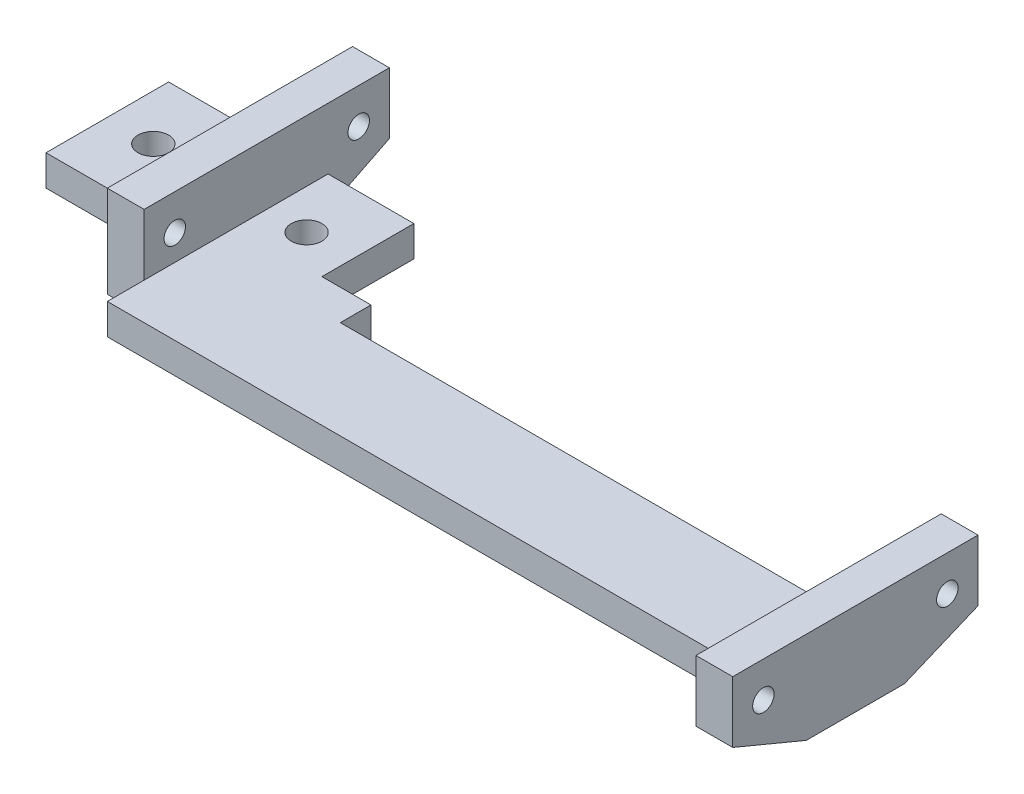
ISO-10303-21;
HEADER;
FILE_DESCRIPTION(('STEP AP214'),'2;1');
FILE_NAME('part.step','',(''),(''),'','','');
FILE_SCHEMA(('AUTOMOTIVE_DESIGN { 1 0 10303 214 1 1 1 1 }'));
ENDSEC;
DATA;
#1=APPLICATION_CONTEXT('core data for automotive mechanical design processes');
#2=APPLICATION_PROTOCOL_DEFINITION('international standard','automotive_design',2000,#1);
#3=PRODUCT_CONTEXT('',#1,'mechanical');
#4=PRODUCT('Part','Part','',(#3));
#5=PRODUCT_RELATED_PRODUCT_CATEGORY('part','',(#4));
#6=PRODUCT_DEFINITION_FORMATION('','',#4);
#7=PRODUCT_DEFINITION_CONTEXT('part definition',#1,'design');
#8=PRODUCT_DEFINITION('design','',#6,#7);
#9=PRODUCT_DEFINITION_SHAPE('','',#8);
#10=(LENGTH_UNIT() NAMED_UNIT(*) SI_UNIT(.MILLI.,.METRE.));
#11=(NAMED_UNIT(*) PLANE_ANGLE_UNIT() SI_UNIT($,.RADIAN.));
#12=(NAMED_UNIT(*) SI_UNIT($,.STERADIAN.) SOLID_ANGLE_UNIT());
#13=UNCERTAINTY_MEASURE_WITH_UNIT(LENGTH_MEASURE(1.E-05),#10,'distance_accuracy_value','');
#14=(GEOMETRIC_REPRESENTATION_CONTEXT(3) GLOBAL_UNCERTAINTY_ASSIGNED_CONTEXT((#13)) GLOBAL_UNIT_ASSIGNED_CONTEXT((#10,
#11,#12)) REPRESENTATION_CONTEXT('',''));
#15=CARTESIAN_POINT('',(0.,0.,0.));
#16=DIRECTION('',(0.,0.,1.));
#17=DIRECTION('',(1.,0.,0.));
#18=AXIS2_PLACEMENT_3D('',#15,#16,#17);
#19=CARTESIAN_POINT('',(100.,5.,0.));
#20=DIRECTION('',(0.,0.,1.));
#21=DIRECTION('',(1.,0.,0.));
#22=AXIS2_PLACEMENT_3D('',#19,#20,#21);
#23=PLANE('',#22);
#24=DIRECTION('',(0.,-1.,0.));
#25=VECTOR('',#24,1.);
#26=CARTESIAN_POINT('',(8.,5.,0.));
#27=LINE('',#26,#25);
#28=CARTESIAN_POINT('',(8.00000000000001,5.,0.));
#29=VERTEX_POINT('',#28);
#30=CARTESIAN_POINT('',(8.00000000000001,0.,0.));
#31=VERTEX_POINT('',#30);
#32=EDGE_CURVE('E54',#29,#31,#27,.T.);
#33=ORIENTED_EDGE('',*,*,#32,.F.);
#34=DIRECTION('',(-1.,0.,0.));
#35=VECTOR('',#34,1.);
#36=CARTESIAN_POINT('',(100.,5.,0.));
#37=LINE('',#36,#35);
#38=CARTESIAN_POINT('',(84.,5.,0.));
#39=VERTEX_POINT('',#38);
#40=EDGE_CURVE('E199',#39,#29,#37,.T.);
#41=ORIENTED_EDGE('',*,*,#40,.F.);
#42=DIRECTION('',(0.,-1.,0.));
#43=VECTOR('',#42,1.);
#44=CARTESIAN_POINT('',(84.,5.,0.));
#45=LINE('',#44,#43);
#46=CARTESIAN_POINT('',(84.,0.,0.));
#47=VERTEX_POINT('',#46);
#48=EDGE_CURVE('E236',#39,#47,#45,.T.);
#49=ORIENTED_EDGE('',*,*,#48,.T.);
#50=DIRECTION('',(-1.,0.,0.));
#51=VECTOR('',#50,1.);
#52=CARTESIAN_POINT('',(100.,0.,0.));
#53=LINE('',#52,#51);
#54=EDGE_CURVE('E370',#47,#31,#53,.T.);
#55=ORIENTED_EDGE('',*,*,#54,.T.);
#56=EDGE_LOOP('',(#33,#41,#49,#55));
#57=FACE_BOUND('',#56,.T.);
#58=ADVANCED_FACE('F40',(#57),#23,.F.);
#59=CARTESIAN_POINT('',(0.,5.,0.));
#60=DIRECTION('',(-1.,0.,0.));
#61=DIRECTION('',(0.,0.,1.));
#62=AXIS2_PLACEMENT_3D('',#59,#60,#61);
#63=PLANE('',#62);
#64=DIRECTION('',(0.,1.,0.));
#65=VECTOR('',#64,1.);
#66=CARTESIAN_POINT('',(0.,5.,-5.));
#67=LINE('',#66,#65);
#68=CARTESIAN_POINT('',(0.,0.,-5.));
#69=VERTEX_POINT('',#68);
#70=CARTESIAN_POINT('',(0.,5.,-5.));
#71=VERTEX_POINT('',#70);
#72=EDGE_CURVE('E191',#69,#71,#67,.T.);
#73=ORIENTED_EDGE('',*,*,#72,.F.);
#74=DIRECTION('',(0.,0.,-1.));
#75=VECTOR('',#74,1.);
#76=CARTESIAN_POINT('',(0.,0.,0.));
#77=LINE('',#76,#75);
#78=CARTESIAN_POINT('',(0.,0.,-20.));
#79=VERTEX_POINT('',#78);
#80=EDGE_CURVE('E384',#69,#79,#77,.T.);
#81=ORIENTED_EDGE('',*,*,#80,.T.);
#82=DIRECTION('',(0.,-1.,0.));
#83=VECTOR('',#82,1.);
#84=CARTESIAN_POINT('',(0.,5.,-20.));
#85=LINE('',#84,#83);
#86=CARTESIAN_POINT('',(0.,5.,-20.));
#87=VERTEX_POINT('',#86);
#88=EDGE_CURVE('E380',#87,#79,#85,.T.);
#89=ORIENTED_EDGE('',*,*,#88,.F.);
#90=DIRECTION('',(0.,0.,-1.));
#91=VECTOR('',#90,1.);
#92=CARTESIAN_POINT('',(0.,5.,0.));
#93=LINE('',#92,#91);
#94=EDGE_CURVE('E62',#71,#87,#93,.T.);
#95=ORIENTED_EDGE('',*,*,#94,.F.);
#96=EDGE_LOOP('',(#73,#81,#89,#95));
#97=FACE_BOUND('',#96,.T.);
#98=ADVANCED_FACE('F446',(#97),#63,.F.);
#99=CARTESIAN_POINT('',(0.,5.,0.));
#100=DIRECTION('',(0.,-1.,0.));
#101=DIRECTION('',(0.,0.,-1.));
#102=AXIS2_PLACEMENT_3D('',#99,#100,#101);
#103=PLANE('',#102);
#104=ORIENTED_EDGE('',*,*,#40,.T.);
#105=DIRECTION('',(0.,0.,1.));
#106=VECTOR('',#105,1.);
#107=CARTESIAN_POINT('',(8.,5.,-5.));
#108=LINE('',#107,#106);
#109=CARTESIAN_POINT('',(8.,5.,-5.));
#110=VERTEX_POINT('',#109);
#111=EDGE_CURVE('E195',#110,#29,#108,.T.);
#112=ORIENTED_EDGE('',*,*,#111,.F.);
#113=DIRECTION('',(1.,0.,0.));
#114=VECTOR('',#113,1.);
#115=CARTESIAN_POINT('',(0.,5.,-5.));
#116=LINE('',#115,#114);
#117=EDGE_CURVE('E184',#71,#110,#116,.T.);
#118=ORIENTED_EDGE('',*,*,#117,.F.);
#119=ORIENTED_EDGE('',*,*,#94,.T.);
#120=DIRECTION('',(-1.,0.,0.));
#121=VECTOR('',#120,1.);
#122=CARTESIAN_POINT('',(0.,5.,-20.));
#123=LINE('',#122,#121);
#124=CARTESIAN_POINT('',(-14.,5.,-20.));
#125=VERTEX_POINT('',#124);
#126=EDGE_CURVE('E375',#87,#125,#123,.T.);
#127=ORIENTED_EDGE('',*,*,#126,.T.);
#128=DIRECTION('',(0.,0.,-1.));
#129=VECTOR('',#128,1.);
#130=CARTESIAN_POINT('',(-14.,5.,-30.));
#131=LINE('',#130,#129);
#132=CARTESIAN_POINT('',(-14.,5.,10.));
#133=VERTEX_POINT('',#132);
#134=EDGE_CURVE('E262',#133,#125,#131,.T.);
#135=ORIENTED_EDGE('',*,*,#134,.F.);
#136=DIRECTION('',(0.,0.,-1.));
#137=VECTOR('',#136,1.);
#138=CARTESIAN_POINT('',(-14.,5.,10.));
#139=LINE('',#138,#137);
#140=CARTESIAN_POINT('',(-14.,5.,16.));
#141=VERTEX_POINT('',#140);
#142=EDGE_CURVE('E201',#141,#133,#139,.T.);
#143=ORIENTED_EDGE('',*,*,#142,.F.);
#144=DIRECTION('',(1.,0.,0.));
#145=VECTOR('',#144,1.);
#146=CARTESIAN_POINT('',(-20.,5.,16.));
#147=LINE('',#146,#145);
#148=CARTESIAN_POINT('',(84.,5.,16.));
#149=VERTEX_POINT('',#148);
#150=EDGE_CURVE('E378',#141,#149,#147,.T.);
#151=ORIENTED_EDGE('',*,*,#150,.T.);
#152=DIRECTION('',(0.64018439966448,0.,0.768221279597376));
#153=VECTOR('',#152,1.);
#154=CARTESIAN_POINT('',(94.,5.,28.));
#155=LINE('',#154,#153);
#156=CARTESIAN_POINT('',(94.,5.,28.));
#157=VERTEX_POINT('',#156);
#158=EDGE_CURVE('E227',#149,#157,#155,.T.);
#159=ORIENTED_EDGE('',*,*,#158,.T.);
#160=DIRECTION('',(0.,0.,-1.));
#161=VECTOR('',#160,1.);
#162=CARTESIAN_POINT('',(94.,5.,0.));
#163=LINE('',#162,#161);
#164=CARTESIAN_POINT('',(94.,5.,-12.));
#165=VERTEX_POINT('',#164);
#166=EDGE_CURVE('E360',#157,#165,#163,.T.);
#167=ORIENTED_EDGE('',*,*,#166,.T.);
#168=DIRECTION('',(-0.640184399664479,0.,0.768221279597377));
#169=VECTOR('',#168,1.);
#170=CARTESIAN_POINT('',(84.,5.,0.));
#171=LINE('',#170,#169);
#172=EDGE_CURVE('E222',#165,#39,#171,.T.);
#173=ORIENTED_EDGE('',*,*,#172,.T.);
#174=EDGE_LOOP('',(#104,#112,#118,#119,#127,#135,#143,#151,#159,#167,#173));
#175=FACE_BOUND('',#174,.T.);
#176=CARTESIAN_POINT('',(-7.5,5.,-10.));
#177=DIRECTION('',(0.,1.,0.));
#178=DIRECTION('',(0.,0.,1.));
#179=AXIS2_PLACEMENT_3D('',#176,#177,#178);
#180=CIRCLE('',#179,2.5);
#181=CARTESIAN_POINT('',(-7.5,5.,-7.5));
#182=VERTEX_POINT('',#181);
#183=EDGE_CURVE('E288',#182,#182,#180,.T.);
#184=ORIENTED_EDGE('',*,*,#183,.F.);
#185=EDGE_LOOP('',(#184));
#186=FACE_BOUND('',#185,.T.);
#187=ADVANCED_FACE('F196',(#175,#186),#103,.F.);
#188=CARTESIAN_POINT('',(94.,0.,16.));
#189=DIRECTION('',(0.,-0.923076923076923,0.384615384615385));
#190=DIRECTION('',(0.,-0.384615384615385,-0.923076923076923));
#191=AXIS2_PLACEMENT_3D('',#188,#189,#190);
#192=PLANE('',#191);
#193=DIRECTION('',(1.,0.,0.));
#194=VECTOR('',#193,1.);
#195=CARTESIAN_POINT('',(94.,5.,28.));
#196=LINE('',#195,#194);
#197=CARTESIAN_POINT('',(100.,5.,28.));
#198=VERTEX_POINT('',#197);
#199=EDGE_CURVE('E361',#157,#198,#196,.T.);
#200=ORIENTED_EDGE('',*,*,#199,.F.);
#201=DIRECTION('',(-0.609710760849692,-0.304855380424846,-0.731652913019631));
#202=VECTOR('',#201,1.);
#203=CARTESIAN_POINT('',(84.,0.,16.));
#204=LINE('',#203,#202);
#205=CARTESIAN_POINT('',(84.,0.,16.));
#206=VERTEX_POINT('',#205);
#207=EDGE_CURVE('E230',#157,#206,#204,.T.);
#208=ORIENTED_EDGE('',*,*,#207,.T.);
#209=DIRECTION('',(1.,0.,0.));
#210=VECTOR('',#209,1.);
#211=CARTESIAN_POINT('',(94.,0.,16.));
#212=LINE('',#211,#210);
#213=CARTESIAN_POINT('',(100.,0.,16.));
#214=VERTEX_POINT('',#213);
#215=EDGE_CURVE('E357',#206,#214,#212,.T.);
#216=ORIENTED_EDGE('',*,*,#215,.T.);
#217=DIRECTION('',(0.,-0.384615384615385,-0.923076923076923));
#218=VECTOR('',#217,1.);
#219=CARTESIAN_POINT('',(100.,0.,16.));
#220=LINE('',#219,#218);
#221=EDGE_CURVE('E337',#198,#214,#220,.T.);
#222=ORIENTED_EDGE('',*,*,#221,.F.);
#223=EDGE_LOOP('',(#200,#208,#216,#222));
#224=FACE_BOUND('',#223,.T.);
#225=ADVANCED_FACE('F492',(#224),#192,.T.);
#226=CARTESIAN_POINT('',(94.,0.,0.));
#227=DIRECTION('',(-1.,0.,0.));
#228=DIRECTION('',(0.,0.,1.));
#229=AXIS2_PLACEMENT_3D('',#226,#227,#228);
#230=PLANE('',#229);
#231=CARTESIAN_POINT('',(94.,9.2,23.));
#232=DIRECTION('',(1.,0.,0.));
#233=DIRECTION('',(0.,0.,-1.));
#234=AXIS2_PLACEMENT_3D('',#231,#232,#233);
#235=CIRCLE('',#234,1.75);
#236=CARTESIAN_POINT('',(94.,9.2,21.25));
#237=VERTEX_POINT('',#236);
#238=EDGE_CURVE('E327',#237,#237,#235,.T.);
#239=ORIENTED_EDGE('',*,*,#238,.T.);
#240=EDGE_LOOP('',(#239));
#241=FACE_BOUND('',#240,.T.);
#242=CARTESIAN_POINT('',(94.,9.2,-7.));
#243=DIRECTION('',(1.,0.,0.));
#244=DIRECTION('',(0.,0.,-1.));
#245=AXIS2_PLACEMENT_3D('',#242,#243,#244);
#246=CIRCLE('',#245,1.75);
#247=CARTESIAN_POINT('',(94.,9.2,-8.75));
#248=VERTEX_POINT('',#247);
#249=EDGE_CURVE('E321',#248,#248,#246,.T.);
#250=ORIENTED_EDGE('',*,*,#249,.T.);
#251=EDGE_LOOP('',(#250));
#252=FACE_BOUND('',#251,.T.);
#253=DIRECTION('',(0.,1.,0.));
#254=VECTOR('',#253,1.);
#255=CARTESIAN_POINT('',(94.,15.,-12.));
#256=LINE('',#255,#254);
#257=CARTESIAN_POINT('',(94.,15.,-12.));
#258=VERTEX_POINT('',#257);
#259=EDGE_CURVE('E333',#165,#258,#256,.T.);
#260=ORIENTED_EDGE('',*,*,#259,.F.);
#261=ORIENTED_EDGE('',*,*,#166,.F.);
#262=DIRECTION('',(0.,-1.,0.));
#263=VECTOR('',#262,1.);
#264=CARTESIAN_POINT('',(94.,5.,28.));
#265=LINE('',#264,#263);
#266=CARTESIAN_POINT('',(94.,15.,28.));
#267=VERTEX_POINT('',#266);
#268=EDGE_CURVE('E340',#267,#157,#265,.T.);
#269=ORIENTED_EDGE('',*,*,#268,.F.);
#270=DIRECTION('',(0.,0.,1.));
#271=VECTOR('',#270,1.);
#272=CARTESIAN_POINT('',(94.,15.,28.));
#273=LINE('',#272,#271);
#274=EDGE_CURVE('E336',#258,#267,#273,.T.);
#275=ORIENTED_EDGE('',*,*,#274,.F.);
#276=EDGE_LOOP('',(#260,#261,#269,#275));
#277=FACE_BOUND('',#276,.T.);
#278=ADVANCED_FACE('F464',(#241,#252,#277),#230,.T.);
#279=CARTESIAN_POINT('',(0.,5.,-20.));
#280=DIRECTION('',(0.,0.,1.));
#281=DIRECTION('',(1.,0.,0.));
#282=AXIS2_PLACEMENT_3D('',#279,#280,#281);
#283=PLANE('',#282);
#284=DIRECTION('',(0.,1.,0.));
#285=VECTOR('',#284,1.);
#286=CARTESIAN_POINT('',(-20.,0.,-20.));
#287=LINE('',#286,#285);
#288=CARTESIAN_POINT('',(-20.,0.,-20.));
#289=VERTEX_POINT('',#288);
#290=CARTESIAN_POINT('',(-20.,5.,-20.));
#291=VERTEX_POINT('',#290);
#292=EDGE_CURVE('E258',#289,#291,#287,.T.);
#293=ORIENTED_EDGE('',*,*,#292,.F.);
#294=DIRECTION('',(-1.,0.,0.));
#295=VECTOR('',#294,1.);
#296=CARTESIAN_POINT('',(0.,0.,-20.));
#297=LINE('',#296,#295);
#298=CARTESIAN_POINT('',(-40.,0.,-20.));
#299=VERTEX_POINT('',#298);
#300=EDGE_CURVE('E386',#289,#299,#297,.T.);
#301=ORIENTED_EDGE('',*,*,#300,.T.);
#302=DIRECTION('',(0.,-1.,0.));
#303=VECTOR('',#302,1.);
#304=CARTESIAN_POINT('',(-40.,5.,-20.));
#305=LINE('',#304,#303);
#306=CARTESIAN_POINT('',(-40.,5.,-20.));
#307=VERTEX_POINT('',#306);
#308=EDGE_CURVE('E312',#307,#299,#305,.T.);
#309=ORIENTED_EDGE('',*,*,#308,.F.);
#310=EDGE_CURVE('E374',#291,#307,#123,.T.);
#311=ORIENTED_EDGE('',*,*,#310,.F.);
#312=EDGE_LOOP('',(#293,#301,#309,#311));
#313=FACE_BOUND('',#312,.T.);
#314=ADVANCED_FACE('F409',(#313),#283,.F.);
#315=DIRECTION('',(0.,-1.,0.));
#316=VECTOR('',#315,1.);
#317=CARTESIAN_POINT('',(-14.,0.,-20.));
#318=LINE('',#317,#316);
#319=CARTESIAN_POINT('',(-14.,0.,-20.));
#320=VERTEX_POINT('',#319);
#321=EDGE_CURVE('E252',#125,#320,#318,.T.);
#322=ORIENTED_EDGE('',*,*,#321,.F.);
#323=ORIENTED_EDGE('',*,*,#126,.F.);
#324=ORIENTED_EDGE('',*,*,#88,.T.);
#325=EDGE_CURVE('E387',#79,#320,#297,.T.);
#326=ORIENTED_EDGE('',*,*,#325,.T.);
#327=EDGE_LOOP('',(#322,#323,#324,#326));
#328=FACE_BOUND('',#327,.T.);
#329=ADVANCED_FACE('F444',(#328),#283,.F.);
#330=CARTESIAN_POINT('',(-32.5,5.,-10.));
#331=DIRECTION('',(0.,1.,0.));
#332=DIRECTION('',(0.,0.,1.));
#333=AXIS2_PLACEMENT_3D('',#330,#331,#332);
#334=CIRCLE('',#333,2.5);
#335=CARTESIAN_POINT('',(-32.5,5.,-7.5));
#336=VERTEX_POINT('',#335);
#337=EDGE_CURVE('E293',#336,#336,#334,.T.);
#338=ORIENTED_EDGE('',*,*,#337,.F.);
#339=EDGE_LOOP('',(#338));
#340=FACE_BOUND('',#339,.T.);
#341=DIRECTION('',(0.,0.,1.));
#342=VECTOR('',#341,1.);
#343=CARTESIAN_POINT('',(-20.,5.,0.));
#344=LINE('',#343,#342);
#345=CARTESIAN_POINT('',(-20.,5.,0.));
#346=VERTEX_POINT('',#345);
#347=EDGE_CURVE('E47',#291,#346,#344,.T.);
#348=ORIENTED_EDGE('',*,*,#347,.F.);
#349=ORIENTED_EDGE('',*,*,#310,.T.);
#350=DIRECTION('',(0.,0.,-1.));
#351=VECTOR('',#350,1.);
#352=CARTESIAN_POINT('',(-40.,5.,-20.));
#353=LINE('',#352,#351);
#354=CARTESIAN_POINT('',(-40.,5.,0.));
#355=VERTEX_POINT('',#354);
#356=EDGE_CURVE('E315',#355,#307,#353,.T.);
#357=ORIENTED_EDGE('',*,*,#356,.F.);
#358=DIRECTION('',(1.,0.,0.));
#359=VECTOR('',#358,1.);
#360=CARTESIAN_POINT('',(-100.615528128088,5.,0.));
#361=LINE('',#360,#359);
#362=EDGE_CURVE('E304',#355,#346,#361,.T.);
#363=ORIENTED_EDGE('',*,*,#362,.T.);
#364=EDGE_LOOP('',(#348,#349,#357,#363));
#365=FACE_BOUND('',#364,.T.);
#366=ADVANCED_FACE('F405',(#340,#365),#103,.F.);
#367=CARTESIAN_POINT('',(-20.,5.,-20.));
#368=DIRECTION('',(1.,0.,0.));
#369=DIRECTION('',(0.,0.,-1.));
#370=AXIS2_PLACEMENT_3D('',#367,#368,#369);
#371=PLANE('',#370);
#372=CARTESIAN_POINT('',(-20.,9.2,-25.));
#373=DIRECTION('',(-1.,0.,0.));
#374=DIRECTION('',(0.,0.,1.));
#375=AXIS2_PLACEMENT_3D('',#372,#373,#374);
#376=CIRCLE('',#375,1.75);
#377=CARTESIAN_POINT('',(-20.,9.2,-23.25));
#378=VERTEX_POINT('',#377);
#379=EDGE_CURVE('E240',#378,#378,#376,.T.);
#380=ORIENTED_EDGE('',*,*,#379,.F.);
#381=EDGE_LOOP('',(#380));
#382=FACE_BOUND('',#381,.T.);
#383=CARTESIAN_POINT('',(-20.,9.2,5.));
#384=DIRECTION('',(-1.,0.,0.));
#385=DIRECTION('',(0.,0.,1.));
#386=AXIS2_PLACEMENT_3D('',#383,#384,#385);
#387=CIRCLE('',#386,1.75);
#388=CARTESIAN_POINT('',(-20.,9.2,6.75));
#389=VERTEX_POINT('',#388);
#390=EDGE_CURVE('E239',#389,#389,#387,.T.);
#391=ORIENTED_EDGE('',*,*,#390,.F.);
#392=EDGE_LOOP('',(#391));
#393=FACE_BOUND('',#392,.T.);
#394=DIRECTION('',(0.,0.,1.));
#395=VECTOR('',#394,1.);
#396=CARTESIAN_POINT('',(-20.,0.,-20.));
#397=LINE('',#396,#395);
#398=CARTESIAN_POINT('',(-20.,0.,0.));
#399=VERTEX_POINT('',#398);
#400=CARTESIAN_POINT('',(-20.,0.,10.));
#401=VERTEX_POINT('',#400);
#402=EDGE_CURVE('E390',#399,#401,#397,.T.);
#403=ORIENTED_EDGE('',*,*,#402,.T.);
#404=DIRECTION('',(0.,-1.,0.));
#405=VECTOR('',#404,1.);
#406=CARTESIAN_POINT('',(-20.,15.,9.99999999999999));
#407=LINE('',#406,#405);
#408=CARTESIAN_POINT('',(-20.,15.,9.99999999999999));
#409=VERTEX_POINT('',#408);
#410=EDGE_CURVE('E286',#409,#401,#407,.T.);
#411=ORIENTED_EDGE('',*,*,#410,.F.);
#412=DIRECTION('',(0.,0.,1.));
#413=VECTOR('',#412,1.);
#414=CARTESIAN_POINT('',(-20.,15.,-30.));
#415=LINE('',#414,#413);
#416=CARTESIAN_POINT('',(-20.,15.,-30.));
#417=VERTEX_POINT('',#416);
#418=EDGE_CURVE('E263',#417,#409,#415,.T.);
#419=ORIENTED_EDGE('',*,*,#418,.F.);
#420=DIRECTION('',(0.,-1.,0.));
#421=VECTOR('',#420,1.);
#422=CARTESIAN_POINT('',(-20.,15.,-30.));
#423=LINE('',#422,#421);
#424=CARTESIAN_POINT('',(-20.,5.,-30.));
#425=VERTEX_POINT('',#424);
#426=EDGE_CURVE('E273',#417,#425,#423,.T.);
#427=ORIENTED_EDGE('',*,*,#426,.T.);
#428=DIRECTION('',(0.,-0.447213595499958,0.894427190999916));
#429=VECTOR('',#428,1.);
#430=CARTESIAN_POINT('',(-20.,5.,-30.));
#431=LINE('',#430,#429);
#432=EDGE_CURVE('E247',#425,#289,#431,.T.);
#433=ORIENTED_EDGE('',*,*,#432,.T.);
#434=ORIENTED_EDGE('',*,*,#292,.T.);
#435=ORIENTED_EDGE('',*,*,#347,.T.);
#436=DIRECTION('',(0.,1.,0.));
#437=VECTOR('',#436,1.);
#438=CARTESIAN_POINT('',(-20.,5.,0.));
#439=LINE('',#438,#437);
#440=EDGE_CURVE('E301',#399,#346,#439,.T.);
#441=ORIENTED_EDGE('',*,*,#440,.F.);
#442=EDGE_LOOP('',(#403,#411,#419,#427,#433,#434,#435,#441));
#443=FACE_BOUND('',#442,.T.);
#444=ADVANCED_FACE('F400',(#382,#393,#443),#371,.F.);
#445=CARTESIAN_POINT('',(-20.,5.,16.));
#446=DIRECTION('',(0.,0.,-1.));
#447=DIRECTION('',(-1.,0.,0.));
#448=AXIS2_PLACEMENT_3D('',#445,#446,#447);
#449=PLANE('',#448);
#450=ORIENTED_EDGE('',*,*,#150,.F.);
#451=DIRECTION('',(0.,1.,0.));
#452=VECTOR('',#451,1.);
#453=CARTESIAN_POINT('',(-14.,-5.,16.));
#454=LINE('',#453,#452);
#455=CARTESIAN_POINT('',(-14.,0.,16.));
#456=VERTEX_POINT('',#455);
#457=EDGE_CURVE('E215',#456,#141,#454,.T.);
#458=ORIENTED_EDGE('',*,*,#457,.F.);
#459=DIRECTION('',(1.,0.,0.));
#460=VECTOR('',#459,1.);
#461=CARTESIAN_POINT('',(-20.,0.,16.));
#462=LINE('',#461,#460);
#463=EDGE_CURVE('E393',#456,#206,#462,.T.);
#464=ORIENTED_EDGE('',*,*,#463,.T.);
#465=DIRECTION('',(0.,1.,0.));
#466=VECTOR('',#465,1.);
#467=CARTESIAN_POINT('',(84.,5.,16.));
#468=LINE('',#467,#466);
#469=EDGE_CURVE('E233',#206,#149,#468,.T.);
#470=ORIENTED_EDGE('',*,*,#469,.T.);
#471=EDGE_LOOP('',(#450,#458,#464,#470));
#472=FACE_BOUND('',#471,.T.);
#473=ADVANCED_FACE('F498',(#472),#449,.F.);
#474=CARTESIAN_POINT('',(100.,5.,16.));
#475=DIRECTION('',(-1.,0.,0.));
#476=DIRECTION('',(0.,0.,1.));
#477=AXIS2_PLACEMENT_3D('',#474,#475,#476);
#478=PLANE('',#477);
#479=DIRECTION('',(0.,0.,-1.));
#480=VECTOR('',#479,1.);
#481=CARTESIAN_POINT('',(100.,0.,16.));
#482=LINE('',#481,#480);
#483=CARTESIAN_POINT('',(100.,0.,0.));
#484=VERTEX_POINT('',#483);
#485=EDGE_CURVE('E372',#214,#484,#482,.T.);
#486=ORIENTED_EDGE('',*,*,#485,.T.);
#487=DIRECTION('',(0.,0.384615384615385,-0.923076923076923));
#488=VECTOR('',#487,1.);
#489=CARTESIAN_POINT('',(100.,5.,-12.));
#490=LINE('',#489,#488);
#491=CARTESIAN_POINT('',(100.,5.,-12.));
#492=VERTEX_POINT('',#491);
#493=EDGE_CURVE('E330',#484,#492,#490,.T.);
#494=ORIENTED_EDGE('',*,*,#493,.T.);
#495=DIRECTION('',(0.,1.,0.));
#496=VECTOR('',#495,1.);
#497=CARTESIAN_POINT('',(100.,15.,-12.));
#498=LINE('',#497,#496);
#499=CARTESIAN_POINT('',(100.,15.,-12.));
#500=VERTEX_POINT('',#499);
#501=EDGE_CURVE('E346',#492,#500,#498,.T.);
#502=ORIENTED_EDGE('',*,*,#501,.T.);
#503=DIRECTION('',(0.,0.,1.));
#504=VECTOR('',#503,1.);
#505=CARTESIAN_POINT('',(100.,15.,28.));
#506=LINE('',#505,#504);
#507=CARTESIAN_POINT('',(100.,15.,28.));
#508=VERTEX_POINT('',#507);
#509=EDGE_CURVE('E349',#500,#508,#506,.T.);
#510=ORIENTED_EDGE('',*,*,#509,.T.);
#511=DIRECTION('',(0.,-1.,0.));
#512=VECTOR('',#511,1.);
#513=CARTESIAN_POINT('',(100.,5.,28.));
#514=LINE('',#513,#512);
#515=EDGE_CURVE('E352',#508,#198,#514,.T.);
#516=ORIENTED_EDGE('',*,*,#515,.T.);
#517=ORIENTED_EDGE('',*,*,#221,.T.);
#518=EDGE_LOOP('',(#486,#494,#502,#510,#516,#517));
#519=FACE_BOUND('',#518,.T.);
#520=CARTESIAN_POINT('',(100.,9.2,-7.));
#521=DIRECTION('',(1.,0.,0.));
#522=DIRECTION('',(0.,0.,-1.));
#523=AXIS2_PLACEMENT_3D('',#520,#521,#522);
#524=CIRCLE('',#523,1.75);
#525=CARTESIAN_POINT('',(100.,9.2,-8.75));
#526=VERTEX_POINT('',#525);
#527=EDGE_CURVE('E308',#526,#526,#524,.T.);
#528=ORIENTED_EDGE('',*,*,#527,.F.);
#529=EDGE_LOOP('',(#528));
#530=FACE_BOUND('',#529,.T.);
#531=CARTESIAN_POINT('',(100.,9.2,23.));
#532=DIRECTION('',(1.,0.,0.));
#533=DIRECTION('',(0.,0.,-1.));
#534=AXIS2_PLACEMENT_3D('',#531,#532,#533);
#535=CIRCLE('',#534,1.75);
#536=CARTESIAN_POINT('',(100.,9.2,21.25));
#537=VERTEX_POINT('',#536);
#538=EDGE_CURVE('E324',#537,#537,#535,.T.);
#539=ORIENTED_EDGE('',*,*,#538,.F.);
#540=EDGE_LOOP('',(#539));
#541=FACE_BOUND('',#540,.T.);
#542=ADVANCED_FACE('F470',(#519,#530,#541),#478,.F.);
#543=CARTESIAN_POINT('',(0.,0.,0.));
#544=DIRECTION('',(0.,-1.,0.));
#545=DIRECTION('',(0.,0.,-1.));
#546=AXIS2_PLACEMENT_3D('',#543,#544,#545);
#547=PLANE('',#546);
#548=ORIENTED_EDGE('',*,*,#80,.F.);
#549=DIRECTION('',(-1.,0.,0.));
#550=VECTOR('',#549,1.);
#551=CARTESIAN_POINT('',(0.,0.,-5.));
#552=LINE('',#551,#550);
#553=CARTESIAN_POINT('',(8.,0.,-5.));
#554=VERTEX_POINT('',#553);
#555=EDGE_CURVE('E207',#554,#69,#552,.T.);
#556=ORIENTED_EDGE('',*,*,#555,.F.);
#557=DIRECTION('',(0.,0.,1.));
#558=VECTOR('',#557,1.);
#559=CARTESIAN_POINT('',(8.,0.,-5.));
#560=LINE('',#559,#558);
#561=EDGE_CURVE('E202',#554,#31,#560,.T.);
#562=ORIENTED_EDGE('',*,*,#561,.T.);
#563=ORIENTED_EDGE('',*,*,#54,.F.);
#564=EDGE_CURVE('E381',#484,#47,#53,.T.);
#565=ORIENTED_EDGE('',*,*,#564,.F.);
#566=ORIENTED_EDGE('',*,*,#485,.F.);
#567=ORIENTED_EDGE('',*,*,#215,.F.);
#568=ORIENTED_EDGE('',*,*,#463,.F.);
#569=DIRECTION('',(0.,0.,1.));
#570=VECTOR('',#569,1.);
#571=CARTESIAN_POINT('',(-14.,0.,0.));
#572=LINE('',#571,#570);
#573=CARTESIAN_POINT('',(-14.,0.,10.));
#574=VERTEX_POINT('',#573);
#575=EDGE_CURVE('E12',#574,#456,#572,.T.);
#576=ORIENTED_EDGE('',*,*,#575,.F.);
#577=DIRECTION('',(1.,0.,0.));
#578=VECTOR('',#577,1.);
#579=CARTESIAN_POINT('',(0.,0.,10.));
#580=LINE('',#579,#578);
#581=EDGE_CURVE('E219',#401,#574,#580,.T.);
#582=ORIENTED_EDGE('',*,*,#581,.F.);
#583=ORIENTED_EDGE('',*,*,#402,.F.);
#584=DIRECTION('',(1.,0.,0.));
#585=VECTOR('',#584,1.);
#586=CARTESIAN_POINT('',(-100.615528128088,0.,0.));
#587=LINE('',#586,#585);
#588=CARTESIAN_POINT('',(-40.,0.,0.));
#589=VERTEX_POINT('',#588);
#590=EDGE_CURVE('E292',#589,#399,#587,.T.);
#591=ORIENTED_EDGE('',*,*,#590,.F.);
#592=DIRECTION('',(0.,0.,1.));
#593=VECTOR('',#592,1.);
#594=CARTESIAN_POINT('',(-40.,0.,-20.));
#595=LINE('',#594,#593);
#596=EDGE_CURVE('E309',#299,#589,#595,.T.);
#597=ORIENTED_EDGE('',*,*,#596,.F.);
#598=ORIENTED_EDGE('',*,*,#300,.F.);
#599=DIRECTION('',(-1.,0.,0.));
#600=VECTOR('',#599,1.);
#601=CARTESIAN_POINT('',(-2.81966011250105,0.,-20.));
#602=LINE('',#601,#600);
#603=EDGE_CURVE('E255',#320,#289,#602,.T.);
#604=ORIENTED_EDGE('',*,*,#603,.F.);
#605=ORIENTED_EDGE('',*,*,#325,.F.);
#606=EDGE_LOOP('',(#548,#556,#562,#563,#565,#566,#567,#568,#576,#582,#583,#591,#597,#598,#604,#605));
#607=FACE_BOUND('',#606,.T.);
#608=CARTESIAN_POINT('',(-32.5,0.,-10.));
#609=DIRECTION('',(0.,1.,0.));
#610=DIRECTION('',(0.,0.,1.));
#611=AXIS2_PLACEMENT_3D('',#608,#609,#610);
#612=CIRCLE('',#611,2.5);
#613=CARTESIAN_POINT('',(-32.5,0.,-7.5));
#614=VERTEX_POINT('',#613);
#615=EDGE_CURVE('E289',#614,#614,#612,.T.);
#616=ORIENTED_EDGE('',*,*,#615,.T.);
#617=EDGE_LOOP('',(#616));
#618=FACE_BOUND('',#617,.T.);
#619=CARTESIAN_POINT('',(-7.5,0.,-10.));
#620=DIRECTION('',(0.,1.,0.));
#621=DIRECTION('',(0.,0.,1.));
#622=AXIS2_PLACEMENT_3D('',#619,#620,#621);
#623=CIRCLE('',#622,2.5);
#624=CARTESIAN_POINT('',(-7.5,0.,-7.5));
#625=VERTEX_POINT('',#624);
#626=EDGE_CURVE('E296',#625,#625,#623,.T.);
#627=ORIENTED_EDGE('',*,*,#626,.T.);
#628=EDGE_LOOP('',(#627));
#629=FACE_BOUND('',#628,.T.);
#630=ADVANCED_FACE('F419',(#607,#618,#629),#547,.T.);
#631=CARTESIAN_POINT('',(94.,5.,28.));
#632=DIRECTION('',(0.,0.,1.));
#633=DIRECTION('',(1.,0.,0.));
#634=AXIS2_PLACEMENT_3D('',#631,#632,#633);
#635=PLANE('',#634);
#636=ORIENTED_EDGE('',*,*,#515,.F.);
#637=DIRECTION('',(1.,0.,0.));
#638=VECTOR('',#637,1.);
#639=CARTESIAN_POINT('',(94.,15.,28.));
#640=LINE('',#639,#638);
#641=EDGE_CURVE('E363',#267,#508,#640,.T.);
#642=ORIENTED_EDGE('',*,*,#641,.F.);
#643=ORIENTED_EDGE('',*,*,#268,.T.);
#644=ORIENTED_EDGE('',*,*,#199,.T.);
#645=EDGE_LOOP('',(#636,#642,#643,#644));
#646=FACE_BOUND('',#645,.T.);
#647=ADVANCED_FACE('F506',(#646),#635,.T.);
#648=CARTESIAN_POINT('',(94.,15.,28.));
#649=DIRECTION('',(0.,1.,0.));
#650=DIRECTION('',(0.,0.,1.));
#651=AXIS2_PLACEMENT_3D('',#648,#649,#650);
#652=PLANE('',#651);
#653=ORIENTED_EDGE('',*,*,#509,.F.);
#654=DIRECTION('',(1.,0.,0.));
#655=VECTOR('',#654,1.);
#656=CARTESIAN_POINT('',(94.,15.,-12.));
#657=LINE('',#656,#655);
#658=EDGE_CURVE('E365',#258,#500,#657,.T.);
#659=ORIENTED_EDGE('',*,*,#658,.F.);
#660=ORIENTED_EDGE('',*,*,#274,.T.);
#661=ORIENTED_EDGE('',*,*,#641,.T.);
#662=EDGE_LOOP('',(#653,#659,#660,#661));
#663=FACE_BOUND('',#662,.T.);
#664=ADVANCED_FACE('F467',(#663),#652,.T.);
#665=CARTESIAN_POINT('',(94.,15.,-12.));
#666=DIRECTION('',(0.,0.,-1.));
#667=DIRECTION('',(0.,1.,0.));
#668=AXIS2_PLACEMENT_3D('',#665,#666,#667);
#669=PLANE('',#668);
#670=ORIENTED_EDGE('',*,*,#501,.F.);
#671=DIRECTION('',(1.,0.,0.));
#672=VECTOR('',#671,1.);
#673=CARTESIAN_POINT('',(94.,5.,-12.));
#674=LINE('',#673,#672);
#675=EDGE_CURVE('E343',#165,#492,#674,.T.);
#676=ORIENTED_EDGE('',*,*,#675,.F.);
#677=ORIENTED_EDGE('',*,*,#259,.T.);
#678=ORIENTED_EDGE('',*,*,#658,.T.);
#679=EDGE_LOOP('',(#670,#676,#677,#678));
#680=FACE_BOUND('',#679,.T.);
#681=ADVANCED_FACE('F461',(#680),#669,.T.);
#682=CARTESIAN_POINT('',(94.,5.,-12.));
#683=DIRECTION('',(0.,-0.923076923076923,-0.384615384615385));
#684=DIRECTION('',(0.,0.384615384615385,-0.923076923076923));
#685=AXIS2_PLACEMENT_3D('',#682,#683,#684);
#686=PLANE('',#685);
#687=DIRECTION('',(0.609710760849692,0.304855380424846,-0.731652913019632));
#688=VECTOR('',#687,1.);
#689=CARTESIAN_POINT('',(94.,5.,-12.));
#690=LINE('',#689,#688);
#691=EDGE_CURVE('E224',#47,#165,#690,.T.);
#692=ORIENTED_EDGE('',*,*,#691,.T.);
#693=ORIENTED_EDGE('',*,*,#675,.T.);
#694=ORIENTED_EDGE('',*,*,#493,.F.);
#695=ORIENTED_EDGE('',*,*,#564,.T.);
#696=EDGE_LOOP('',(#692,#693,#694,#695));
#697=FACE_BOUND('',#696,.T.);
#698=ADVANCED_FACE('F472',(#697),#686,.T.);
#699=CARTESIAN_POINT('',(94.,9.2,23.));
#700=DIRECTION('',(1.,0.,0.));
#701=DIRECTION('',(0.,0.,-1.));
#702=AXIS2_PLACEMENT_3D('',#699,#700,#701);
#703=CYLINDRICAL_SURFACE('',#702,1.75);
#704=ORIENTED_EDGE('',*,*,#238,.F.);
#705=EDGE_LOOP('',(#704));
#706=FACE_BOUND('',#705,.T.);
#707=ORIENTED_EDGE('',*,*,#538,.T.);
#708=EDGE_LOOP('',(#707));
#709=FACE_BOUND('',#708,.T.);
#710=ADVANCED_FACE('F474',(#706,#709),#703,.F.);
#711=CARTESIAN_POINT('',(94.,9.2,-7.));
#712=DIRECTION('',(1.,0.,0.));
#713=DIRECTION('',(0.,0.,-1.));
#714=AXIS2_PLACEMENT_3D('',#711,#712,#713);
#715=CYLINDRICAL_SURFACE('',#714,1.75);
#716=ORIENTED_EDGE('',*,*,#249,.F.);
#717=EDGE_LOOP('',(#716));
#718=FACE_BOUND('',#717,.T.);
#719=ORIENTED_EDGE('',*,*,#527,.T.);
#720=EDGE_LOOP('',(#719));
#721=FACE_BOUND('',#720,.T.);
#722=ADVANCED_FACE('F480',(#718,#721),#715,.F.);
#723=CARTESIAN_POINT('',(-100.615528128088,5.,0.));
#724=DIRECTION('',(0.,0.,-1.));
#725=DIRECTION('',(-1.,0.,0.));
#726=AXIS2_PLACEMENT_3D('',#723,#724,#725);
#727=PLANE('',#726);
#728=DIRECTION('',(0.,1.,0.));
#729=VECTOR('',#728,1.);
#730=CARTESIAN_POINT('',(-40.,5.,0.));
#731=LINE('',#730,#729);
#732=EDGE_CURVE('E305',#589,#355,#731,.T.);
#733=ORIENTED_EDGE('',*,*,#732,.F.);
#734=ORIENTED_EDGE('',*,*,#590,.T.);
#735=ORIENTED_EDGE('',*,*,#440,.T.);
#736=ORIENTED_EDGE('',*,*,#362,.F.);
#737=EDGE_LOOP('',(#733,#734,#735,#736));
#738=FACE_BOUND('',#737,.T.);
#739=ADVANCED_FACE('F416',(#738),#727,.F.);
#740=CARTESIAN_POINT('',(-40.,5.,0.));
#741=DIRECTION('',(-1.,0.,0.));
#742=DIRECTION('',(0.,0.,1.));
#743=AXIS2_PLACEMENT_3D('',#740,#741,#742);
#744=PLANE('',#743);
#745=ORIENTED_EDGE('',*,*,#356,.T.);
#746=ORIENTED_EDGE('',*,*,#308,.T.);
#747=ORIENTED_EDGE('',*,*,#596,.T.);
#748=ORIENTED_EDGE('',*,*,#732,.T.);
#749=EDGE_LOOP('',(#745,#746,#747,#748));
#750=FACE_BOUND('',#749,.T.);
#751=ADVANCED_FACE('F413',(#750),#744,.T.);
#752=CARTESIAN_POINT('',(-7.5,0.,-10.));
#753=DIRECTION('',(0.,1.,0.));
#754=DIRECTION('',(0.,0.,1.));
#755=AXIS2_PLACEMENT_3D('',#752,#753,#754);
#756=CYLINDRICAL_SURFACE('',#755,2.5);
#757=ORIENTED_EDGE('',*,*,#626,.F.);
#758=EDGE_LOOP('',(#757));
#759=FACE_BOUND('',#758,.T.);
#760=ORIENTED_EDGE('',*,*,#183,.T.);
#761=EDGE_LOOP('',(#760));
#762=FACE_BOUND('',#761,.T.);
#763=ADVANCED_FACE('F516',(#759,#762),#756,.F.);
#764=CARTESIAN_POINT('',(-32.5,0.,-10.));
#765=DIRECTION('',(0.,1.,0.));
#766=DIRECTION('',(0.,0.,1.));
#767=AXIS2_PLACEMENT_3D('',#764,#765,#766);
#768=CYLINDRICAL_SURFACE('',#767,2.5);
#769=ORIENTED_EDGE('',*,*,#615,.F.);
#770=EDGE_LOOP('',(#769));
#771=FACE_BOUND('',#770,.T.);
#772=ORIENTED_EDGE('',*,*,#337,.T.);
#773=EDGE_LOOP('',(#772));
#774=FACE_BOUND('',#773,.T.);
#775=ADVANCED_FACE('F514',(#771,#774),#768,.F.);
#776=CARTESIAN_POINT('',(-20.,15.,9.99999999999999));
#777=DIRECTION('',(0.,0.,-1.));
#778=DIRECTION('',(-1.,0.,0.));
#779=AXIS2_PLACEMENT_3D('',#776,#777,#778);
#780=PLANE('',#779);
#781=ORIENTED_EDGE('',*,*,#410,.T.);
#782=ORIENTED_EDGE('',*,*,#581,.T.);
#783=DIRECTION('',(0.,1.,0.));
#784=VECTOR('',#783,1.);
#785=CARTESIAN_POINT('',(-14.,-5.,10.));
#786=LINE('',#785,#784);
#787=EDGE_CURVE('E216',#574,#133,#786,.T.);
#788=ORIENTED_EDGE('',*,*,#787,.T.);
#789=DIRECTION('',(0.,-1.,0.));
#790=VECTOR('',#789,1.);
#791=CARTESIAN_POINT('',(-14.,15.,10.));
#792=LINE('',#791,#790);
#793=CARTESIAN_POINT('',(-14.,15.,10.));
#794=VERTEX_POINT('',#793);
#795=EDGE_CURVE('E283',#794,#133,#792,.T.);
#796=ORIENTED_EDGE('',*,*,#795,.F.);
#797=DIRECTION('',(1.,0.,0.));
#798=VECTOR('',#797,1.);
#799=CARTESIAN_POINT('',(-20.,15.,9.99999999999999));
#800=LINE('',#799,#798);
#801=EDGE_CURVE('E266',#409,#794,#800,.T.);
#802=ORIENTED_EDGE('',*,*,#801,.F.);
#803=EDGE_LOOP('',(#781,#782,#788,#796,#802));
#804=FACE_BOUND('',#803,.T.);
#805=ADVANCED_FACE('F426',(#804),#780,.F.);
#806=CARTESIAN_POINT('',(-14.,15.,-30.));
#807=DIRECTION('',(-1.,0.,0.));
#808=DIRECTION('',(0.,0.,1.));
#809=AXIS2_PLACEMENT_3D('',#806,#807,#808);
#810=PLANE('',#809);
#811=CARTESIAN_POINT('',(-14.,9.2,-25.));
#812=DIRECTION('',(-1.,0.,0.));
#813=DIRECTION('',(0.,0.,1.));
#814=AXIS2_PLACEMENT_3D('',#811,#812,#813);
#815=CIRCLE('',#814,1.75);
#816=CARTESIAN_POINT('',(-14.,9.2,-23.25));
#817=VERTEX_POINT('',#816);
#818=EDGE_CURVE('E243',#817,#817,#815,.F.);
#819=ORIENTED_EDGE('',*,*,#818,.F.);
#820=EDGE_LOOP('',(#819));
#821=FACE_BOUND('',#820,.T.);
#822=CARTESIAN_POINT('',(-14.,9.2,5.));
#823=DIRECTION('',(-1.,0.,0.));
#824=DIRECTION('',(0.,0.,1.));
#825=AXIS2_PLACEMENT_3D('',#822,#823,#824);
#826=CIRCLE('',#825,1.75);
#827=CARTESIAN_POINT('',(-14.,9.2,6.75));
#828=VERTEX_POINT('',#827);
#829=EDGE_CURVE('E244',#828,#828,#826,.F.);
#830=ORIENTED_EDGE('',*,*,#829,.F.);
#831=EDGE_LOOP('',(#830));
#832=FACE_BOUND('',#831,.T.);
#833=ORIENTED_EDGE('',*,*,#134,.T.);
#834=ORIENTED_EDGE('',*,*,#321,.T.);
#835=DIRECTION('',(0.,0.447213595499958,-0.894427190999916));
#836=VECTOR('',#835,1.);
#837=CARTESIAN_POINT('',(-14.,5.,-30.));
#838=LINE('',#837,#836);
#839=CARTESIAN_POINT('',(-14.,5.,-30.));
#840=VERTEX_POINT('',#839);
#841=EDGE_CURVE('E254',#320,#840,#838,.T.);
#842=ORIENTED_EDGE('',*,*,#841,.T.);
#843=DIRECTION('',(0.,-1.,0.));
#844=VECTOR('',#843,1.);
#845=CARTESIAN_POINT('',(-14.,15.,-30.));
#846=LINE('',#845,#844);
#847=CARTESIAN_POINT('',(-14.,15.,-30.));
#848=VERTEX_POINT('',#847);
#849=EDGE_CURVE('E280',#848,#840,#846,.T.);
#850=ORIENTED_EDGE('',*,*,#849,.F.);
#851=DIRECTION('',(0.,0.,-1.));
#852=VECTOR('',#851,1.);
#853=CARTESIAN_POINT('',(-14.,15.,-30.));
#854=LINE('',#853,#852);
#855=EDGE_CURVE('E269',#794,#848,#854,.T.);
#856=ORIENTED_EDGE('',*,*,#855,.F.);
#857=ORIENTED_EDGE('',*,*,#795,.T.);
#858=EDGE_LOOP('',(#833,#834,#842,#850,#856,#857));
#859=FACE_BOUND('',#858,.T.);
#860=ADVANCED_FACE('F523',(#821,#832,#859),#810,.F.);
#861=CARTESIAN_POINT('',(-20.,15.,-30.));
#862=DIRECTION('',(0.,0.,1.));
#863=DIRECTION('',(1.,0.,0.));
#864=AXIS2_PLACEMENT_3D('',#861,#862,#863);
#865=PLANE('',#864);
#866=DIRECTION('',(-1.,0.,0.));
#867=VECTOR('',#866,1.);
#868=CARTESIAN_POINT('',(-20.,5.,-30.));
#869=LINE('',#868,#867);
#870=EDGE_CURVE('E267',#840,#425,#869,.T.);
#871=ORIENTED_EDGE('',*,*,#870,.T.);
#872=ORIENTED_EDGE('',*,*,#426,.F.);
#873=DIRECTION('',(-1.,0.,0.));
#874=VECTOR('',#873,1.);
#875=CARTESIAN_POINT('',(-20.,15.,-30.));
#876=LINE('',#875,#874);
#877=EDGE_CURVE('E271',#848,#417,#876,.T.);
#878=ORIENTED_EDGE('',*,*,#877,.F.);
#879=ORIENTED_EDGE('',*,*,#849,.T.);
#880=EDGE_LOOP('',(#871,#872,#878,#879));
#881=FACE_BOUND('',#880,.T.);
#882=ADVANCED_FACE('F436',(#881),#865,.F.);
#883=CARTESIAN_POINT('',(0.,15.,0.));
#884=DIRECTION('',(0.,1.,0.));
#885=DIRECTION('',(0.,0.,1.));
#886=AXIS2_PLACEMENT_3D('',#883,#884,#885);
#887=PLANE('',#886);
#888=ORIENTED_EDGE('',*,*,#418,.T.);
#889=ORIENTED_EDGE('',*,*,#801,.T.);
#890=ORIENTED_EDGE('',*,*,#855,.T.);
#891=ORIENTED_EDGE('',*,*,#877,.T.);
#892=EDGE_LOOP('',(#888,#889,#890,#891));
#893=FACE_BOUND('',#892,.T.);
#894=ADVANCED_FACE('F431',(#893),#887,.T.);
#895=CARTESIAN_POINT('',(-2.81966011250105,5.,-30.));
#896=DIRECTION('',(0.,-0.894427190999916,-0.447213595499958));
#897=DIRECTION('',(0.,0.447213595499958,-0.894427190999916));
#898=AXIS2_PLACEMENT_3D('',#895,#896,#897);
#899=PLANE('',#898);
#900=ORIENTED_EDGE('',*,*,#841,.F.);
#901=ORIENTED_EDGE('',*,*,#603,.T.);
#902=ORIENTED_EDGE('',*,*,#432,.F.);
#903=ORIENTED_EDGE('',*,*,#870,.F.);
#904=EDGE_LOOP('',(#900,#901,#902,#903));
#905=FACE_BOUND('',#904,.T.);
#906=ADVANCED_FACE('F440',(#905),#899,.T.);
#907=CARTESIAN_POINT('',(100.001,9.2,5.));
#908=DIRECTION('',(-1.,0.,0.));
#909=DIRECTION('',(0.,0.,1.));
#910=AXIS2_PLACEMENT_3D('',#907,#908,#909);
#911=CYLINDRICAL_SURFACE('',#910,1.75);
#912=CARTESIAN_POINT('',(-20.,9.2,6.75));
#913=CARTESIAN_POINT('',(-19.9375,9.2,6.75));
#914=CARTESIAN_POINT('',(-19.875,9.2,6.75));
#915=CARTESIAN_POINT('',(-19.75,9.2,6.75));
#916=CARTESIAN_POINT('',(-19.6875,9.2,6.75));
#917=CARTESIAN_POINT('',(-19.5625,9.2,6.75));
#918=CARTESIAN_POINT('',(-19.5,9.2,6.75));
#919=CARTESIAN_POINT('',(-19.375,9.2,6.75));
#920=CARTESIAN_POINT('',(-19.3125,9.2,6.75));
#921=CARTESIAN_POINT('',(-19.1875,9.2,6.75));
#922=CARTESIAN_POINT('',(-19.125,9.2,6.75));
#923=CARTESIAN_POINT('',(-19.,9.2,6.75));
#924=CARTESIAN_POINT('',(-18.9375,9.2,6.75));
#925=CARTESIAN_POINT('',(-18.8125,9.2,6.75));
#926=CARTESIAN_POINT('',(-18.75,9.2,6.75));
#927=CARTESIAN_POINT('',(-18.625,9.2,6.75));
#928=CARTESIAN_POINT('',(-18.5625,9.2,6.75));
#929=CARTESIAN_POINT('',(-18.4375,9.2,6.75));
#930=CARTESIAN_POINT('',(-18.375,9.2,6.75));
#931=CARTESIAN_POINT('',(-18.25,9.2,6.75));
#932=CARTESIAN_POINT('',(-18.1875,9.2,6.75));
#933=CARTESIAN_POINT('',(-18.0625,9.2,6.75));
#934=CARTESIAN_POINT('',(-18.,9.2,6.75));
#935=CARTESIAN_POINT('',(-17.875,9.2,6.75));
#936=CARTESIAN_POINT('',(-17.8125,9.2,6.75));
#937=CARTESIAN_POINT('',(-17.6875,9.2,6.75));
#938=CARTESIAN_POINT('',(-17.625,9.2,6.75));
#939=CARTESIAN_POINT('',(-17.5,9.2,6.75));
#940=CARTESIAN_POINT('',(-17.4375,9.2,6.75));
#941=CARTESIAN_POINT('',(-17.3125,9.2,6.75));
#942=CARTESIAN_POINT('',(-17.25,9.2,6.75));
#943=CARTESIAN_POINT('',(-17.125,9.2,6.75));
#944=CARTESIAN_POINT('',(-17.0625,9.2,6.75));
#945=CARTESIAN_POINT('',(-16.9375,9.2,6.75));
#946=CARTESIAN_POINT('',(-16.875,9.2,6.75));
#947=CARTESIAN_POINT('',(-16.75,9.2,6.75));
#948=CARTESIAN_POINT('',(-16.6875,9.2,6.75));
#949=CARTESIAN_POINT('',(-16.5625,9.2,6.75));
#950=CARTESIAN_POINT('',(-16.5,9.2,6.75));
#951=CARTESIAN_POINT('',(-16.375,9.2,6.75));
#952=CARTESIAN_POINT('',(-16.3125,9.2,6.75));
#953=CARTESIAN_POINT('',(-16.1875,9.2,6.75));
#954=CARTESIAN_POINT('',(-16.125,9.2,6.75));
#955=CARTESIAN_POINT('',(-16.,9.2,6.75));
#956=CARTESIAN_POINT('',(-15.9375,9.2,6.75));
#957=CARTESIAN_POINT('',(-15.8125,9.2,6.75));
#958=CARTESIAN_POINT('',(-15.75,9.2,6.75));
#959=CARTESIAN_POINT('',(-15.625,9.2,6.75));
#960=CARTESIAN_POINT('',(-15.5625,9.2,6.75));
#961=CARTESIAN_POINT('',(-15.4375,9.2,6.75));
#962=CARTESIAN_POINT('',(-15.375,9.2,6.75));
#963=CARTESIAN_POINT('',(-15.25,9.2,6.75));
#964=CARTESIAN_POINT('',(-15.1875,9.2,6.75));
#965=CARTESIAN_POINT('',(-15.0625,9.2,6.75));
#966=CARTESIAN_POINT('',(-15.,9.2,6.75));
#967=CARTESIAN_POINT('',(-14.875,9.2,6.75));
#968=CARTESIAN_POINT('',(-14.8125,9.2,6.75));
#969=CARTESIAN_POINT('',(-14.6875,9.2,6.75));
#970=CARTESIAN_POINT('',(-14.625,9.2,6.75));
#971=CARTESIAN_POINT('',(-14.5,9.2,6.75));
#972=CARTESIAN_POINT('',(-14.4375,9.2,6.75));
#973=CARTESIAN_POINT('',(-14.3125,9.2,6.75));
#974=CARTESIAN_POINT('',(-14.25,9.2,6.75));
#975=CARTESIAN_POINT('',(-14.125,9.2,6.75));
#976=CARTESIAN_POINT('',(-14.0625,9.2,6.75));
#977=CARTESIAN_POINT('',(-14.,9.2,6.75));
#978=B_SPLINE_CURVE_WITH_KNOTS('',3,(#912,#913,#914,#915,#916,#917,#918,#919,#920,#921,#922,
#923,#924,#925,#926,#927,#928,#929,#930,#931,#932,#933,#934,#935,#936,#937,#938,#939,#940,#941,
#942,#943,#944,#945,#946,#947,#948,#949,#950,#951,#952,#953,#954,#955,#956,#957,#958,#959,#960,
#961,#962,#963,#964,#965,#966,#967,#968,#969,#970,#971,#972,#973,#974,#975,#976,#977),
.UNSPECIFIED.,.F.,.F.,(4,2,2,2,2,2,2,2,2,2,2,2,2,2,2,2,2,2,2,2,2,2,2,2,2,2,2,2,2,2,2,2,4),(0.,
0.187500000000007,0.375,0.562499999999994,0.750000000000001,0.937500000000008,1.125,
1.31249999999999,1.5,1.68750000000001,1.875,2.06249999999999,2.25,2.43750000000001,2.625,2.8125,
3.,3.18750000000001,3.375,3.5625,3.75,3.93750000000001,4.125,4.3125,4.5,4.68750000000001,4.875,
5.0625,5.25,5.43750000000001,5.62500000000001,5.8125,6.00000000000001),.UNSPECIFIED.);
#979=EDGE_CURVE('BSEAM669',#389,#828,#978,.T.);
#980=ORIENTED_EDGE('',*,*,#390,.T.);
#981=ORIENTED_EDGE('',*,*,#829,.T.);
#982=ORIENTED_EDGE('',*,*,#979,.T.);
#983=ORIENTED_EDGE('',*,*,#979,.F.);
#984=EDGE_LOOP('',(#980,#982,#981,#983));
#985=FACE_BOUND('',#984,.T.);
#986=ADVANCED_FACE('F669',(#985),#911,.F.);
#987=CARTESIAN_POINT('',(100.001,9.2,-25.));
#988=DIRECTION('',(-1.,0.,0.));
#989=DIRECTION('',(0.,0.,1.));
#990=AXIS2_PLACEMENT_3D('',#987,#988,#989);
#991=CYLINDRICAL_SURFACE('',#990,1.75);
#992=CARTESIAN_POINT('',(-20.,9.2,-23.25));
#993=CARTESIAN_POINT('',(-19.9375,9.2,-23.25));
#994=CARTESIAN_POINT('',(-19.875,9.2,-23.25));
#995=CARTESIAN_POINT('',(-19.75,9.2,-23.25));
#996=CARTESIAN_POINT('',(-19.6875,9.2,-23.25));
#997=CARTESIAN_POINT('',(-19.5625,9.2,-23.25));
#998=CARTESIAN_POINT('',(-19.5,9.2,-23.25));
#999=CARTESIAN_POINT('',(-19.375,9.2,-23.25));
#1000=CARTESIAN_POINT('',(-19.3125,9.2,-23.25));
#1001=CARTESIAN_POINT('',(-19.1875,9.2,-23.25));
#1002=CARTESIAN_POINT('',(-19.125,9.2,-23.25));
#1003=CARTESIAN_POINT('',(-19.,9.2,-23.25));
#1004=CARTESIAN_POINT('',(-18.9375,9.2,-23.25));
#1005=CARTESIAN_POINT('',(-18.8125,9.2,-23.25));
#1006=CARTESIAN_POINT('',(-18.75,9.2,-23.25));
#1007=CARTESIAN_POINT('',(-18.625,9.2,-23.25));
#1008=CARTESIAN_POINT('',(-18.5625,9.2,-23.25));
#1009=CARTESIAN_POINT('',(-18.4375,9.2,-23.25));
#1010=CARTESIAN_POINT('',(-18.375,9.2,-23.25));
#1011=CARTESIAN_POINT('',(-18.25,9.2,-23.25));
#1012=CARTESIAN_POINT('',(-18.1875,9.2,-23.25));
#1013=CARTESIAN_POINT('',(-18.0625,9.2,-23.25));
#1014=CARTESIAN_POINT('',(-18.,9.2,-23.25));
#1015=CARTESIAN_POINT('',(-17.875,9.2,-23.25));
#1016=CARTESIAN_POINT('',(-17.8125,9.2,-23.25));
#1017=CARTESIAN_POINT('',(-17.6875,9.2,-23.25));
#1018=CARTESIAN_POINT('',(-17.625,9.2,-23.25));
#1019=CARTESIAN_POINT('',(-17.5,9.2,-23.25));
#1020=CARTESIAN_POINT('',(-17.4375,9.2,-23.25));
#1021=CARTESIAN_POINT('',(-17.3125,9.2,-23.25));
#1022=CARTESIAN_POINT('',(-17.25,9.2,-23.25));
#1023=CARTESIAN_POINT('',(-17.125,9.2,-23.25));
#1024=CARTESIAN_POINT('',(-17.0625,9.2,-23.25));
#1025=CARTESIAN_POINT('',(-16.9375,9.2,-23.25));
#1026=CARTESIAN_POINT('',(-16.875,9.2,-23.25));
#1027=CARTESIAN_POINT('',(-16.75,9.2,-23.25));
#1028=CARTESIAN_POINT('',(-16.6875,9.2,-23.25));
#1029=CARTESIAN_POINT('',(-16.5625,9.2,-23.25));
#1030=CARTESIAN_POINT('',(-16.5,9.2,-23.25));
#1031=CARTESIAN_POINT('',(-16.375,9.2,-23.25));
#1032=CARTESIAN_POINT('',(-16.3125,9.2,-23.25));
#1033=CARTESIAN_POINT('',(-16.1875,9.2,-23.25));
#1034=CARTESIAN_POINT('',(-16.125,9.2,-23.25));
#1035=CARTESIAN_POINT('',(-16.,9.2,-23.25));
#1036=CARTESIAN_POINT('',(-15.9375,9.2,-23.25));
#1037=CARTESIAN_POINT('',(-15.8125,9.2,-23.25));
#1038=CARTESIAN_POINT('',(-15.75,9.2,-23.25));
#1039=CARTESIAN_POINT('',(-15.625,9.2,-23.25));
#1040=CARTESIAN_POINT('',(-15.5625,9.2,-23.25));
#1041=CARTESIAN_POINT('',(-15.4375,9.2,-23.25));
#1042=CARTESIAN_POINT('',(-15.375,9.2,-23.25));
#1043=CARTESIAN_POINT('',(-15.25,9.2,-23.25));
#1044=CARTESIAN_POINT('',(-15.1875,9.2,-23.25));
#1045=CARTESIAN_POINT('',(-15.0625,9.2,-23.25));
#1046=CARTESIAN_POINT('',(-15.,9.2,-23.25));
#1047=CARTESIAN_POINT('',(-14.875,9.2,-23.25));
#1048=CARTESIAN_POINT('',(-14.8125,9.2,-23.25));
#1049=CARTESIAN_POINT('',(-14.6875,9.2,-23.25));
#1050=CARTESIAN_POINT('',(-14.625,9.2,-23.25));
#1051=CARTESIAN_POINT('',(-14.5,9.2,-23.25));
#1052=CARTESIAN_POINT('',(-14.4375,9.2,-23.25));
#1053=CARTESIAN_POINT('',(-14.3125,9.2,-23.25));
#1054=CARTESIAN_POINT('',(-14.25,9.2,-23.25));
#1055=CARTESIAN_POINT('',(-14.125,9.2,-23.25));
#1056=CARTESIAN_POINT('',(-14.0625,9.2,-23.25));
#1057=CARTESIAN_POINT('',(-14.,9.2,-23.25));
#1058=B_SPLINE_CURVE_WITH_KNOTS('',3,(#992,#993,#994,#995,#996,#997,#998,#999,#1000,#1001,#1002,
#1003,#1004,#1005,#1006,#1007,#1008,#1009,#1010,#1011,#1012,#1013,#1014,#1015,#1016,#1017,#1018,
#1019,#1020,#1021,#1022,#1023,#1024,#1025,#1026,#1027,#1028,#1029,#1030,#1031,#1032,#1033,#1034,
#1035,#1036,#1037,#1038,#1039,#1040,#1041,#1042,#1043,#1044,#1045,#1046,#1047,#1048,#1049,#1050,
#1051,#1052,#1053,#1054,#1055,#1056,#1057),.UNSPECIFIED.,.F.,.F.,(4,2,2,2,2,2,2,2,2,2,2,2,2,2,2,
2,2,2,2,2,2,2,2,2,2,2,2,2,2,2,2,2,4),(0.,0.187500000000007,0.375,0.562499999999994,
0.750000000000001,0.937500000000008,1.125,1.31249999999999,1.5,1.68750000000001,1.875,
2.06249999999999,2.25,2.43750000000001,2.625,2.8125,3.,3.18750000000001,3.375,3.5625,3.75,
3.93750000000001,4.125,4.3125,4.5,4.68750000000001,4.875,5.0625,5.25,5.43750000000001,
5.62500000000001,5.8125,6.00000000000001),.UNSPECIFIED.);
#1059=EDGE_CURVE('BSEAM665',#378,#817,#1058,.T.);
#1060=ORIENTED_EDGE('',*,*,#379,.T.);
#1061=ORIENTED_EDGE('',*,*,#818,.T.);
#1062=ORIENTED_EDGE('',*,*,#1059,.T.);
#1063=ORIENTED_EDGE('',*,*,#1059,.F.);
#1064=EDGE_LOOP('',(#1060,#1062,#1061,#1063));
#1065=FACE_BOUND('',#1064,.T.);
#1066=ADVANCED_FACE('F665',(#1065),#991,.F.);
#1067=CARTESIAN_POINT('',(41.7049180327869,0.,-34.7540983606557));
#1068=DIRECTION('',(-0.768221279597376,0.,0.64018439966448));
#1069=DIRECTION('',(0.64018439966448,0.,0.768221279597376));
#1070=AXIS2_PLACEMENT_3D('',#1067,#1068,#1069);
#1071=PLANE('',#1070);
#1072=ORIENTED_EDGE('',*,*,#158,.F.);
#1073=ORIENTED_EDGE('',*,*,#469,.F.);
#1074=ORIENTED_EDGE('',*,*,#207,.F.);
#1075=EDGE_LOOP('',(#1072,#1073,#1074));
#1076=FACE_BOUND('',#1075,.T.);
#1077=ADVANCED_FACE('F577',(#1076),#1071,.T.);
#1078=CARTESIAN_POINT('',(49.5737704918033,0.,41.311475409836));
#1079=DIRECTION('',(0.768221279597376,0.,0.640184399664479));
#1080=DIRECTION('',(0.640184399664479,0.,-0.768221279597377));
#1081=AXIS2_PLACEMENT_3D('',#1078,#1079,#1080);
#1082=PLANE('',#1081);
#1083=ORIENTED_EDGE('',*,*,#172,.F.);
#1084=ORIENTED_EDGE('',*,*,#691,.F.);
#1085=ORIENTED_EDGE('',*,*,#48,.F.);
#1086=EDGE_LOOP('',(#1083,#1084,#1085));
#1087=FACE_BOUND('',#1086,.T.);
#1088=ADVANCED_FACE('F451',(#1087),#1082,.F.);
#1089=CARTESIAN_POINT('',(-14.,-5.,10.));
#1090=DIRECTION('',(1.,0.,0.));
#1091=DIRECTION('',(0.,0.,-1.));
#1092=AXIS2_PLACEMENT_3D('',#1089,#1090,#1091);
#1093=PLANE('',#1092);
#1094=ORIENTED_EDGE('',*,*,#575,.T.);
#1095=ORIENTED_EDGE('',*,*,#457,.T.);
#1096=ORIENTED_EDGE('',*,*,#142,.T.);
#1097=ORIENTED_EDGE('',*,*,#787,.F.);
#1098=EDGE_LOOP('',(#1094,#1095,#1096,#1097));
#1099=FACE_BOUND('',#1098,.T.);
#1100=ADVANCED_FACE('F576',(#1099),#1093,.F.);
#1101=CARTESIAN_POINT('',(8.,5.,-5.));
#1102=DIRECTION('',(-1.,0.,0.));
#1103=DIRECTION('',(0.,-1.,0.));
#1104=AXIS2_PLACEMENT_3D('',#1101,#1102,#1103);
#1105=PLANE('',#1104);
#1106=ORIENTED_EDGE('',*,*,#32,.T.);
#1107=ORIENTED_EDGE('',*,*,#561,.F.);
#1108=DIRECTION('',(0.,-1.,0.));
#1109=VECTOR('',#1108,1.);
#1110=CARTESIAN_POINT('',(8.,5.,-5.));
#1111=LINE('',#1110,#1109);
#1112=EDGE_CURVE('E189',#110,#554,#1111,.T.);
#1113=ORIENTED_EDGE('',*,*,#1112,.F.);
#1114=ORIENTED_EDGE('',*,*,#111,.T.);
#1115=EDGE_LOOP('',(#1106,#1107,#1113,#1114));
#1116=FACE_BOUND('',#1115,.T.);
#1117=ADVANCED_FACE('F204',(#1116),#1105,.F.);
#1118=CARTESIAN_POINT('',(0.,0.,-5.));
#1119=DIRECTION('',(0.,0.,1.));
#1120=DIRECTION('',(1.,0.,0.));
#1121=AXIS2_PLACEMENT_3D('',#1118,#1119,#1120);
#1122=PLANE('',#1121);
#1123=ORIENTED_EDGE('',*,*,#72,.T.);
#1124=ORIENTED_EDGE('',*,*,#117,.T.);
#1125=ORIENTED_EDGE('',*,*,#1112,.T.);
#1126=ORIENTED_EDGE('',*,*,#555,.T.);
#1127=EDGE_LOOP('',(#1123,#1124,#1125,#1126));
#1128=FACE_BOUND('',#1127,.T.);
#1129=ADVANCED_FACE('F186',(#1128),#1122,.F.);
#1130=CLOSED_SHELL('',(#58,#98,#187,#225,#278,#314,#329,#366,#444,#473,#542,#630,#647,#664,#681,
#698,#710,#722,#739,#751,#763,#775,#805,#860,#882,#894,#906,#986,#1066,#1077,#1088,#1100,#1117,#1129));
#1131=MANIFOLD_SOLID_BREP('B2',#1130);
#1132=ADVANCED_BREP_SHAPE_REPRESENTATION('',(#18,#1131),#14);
#1133=SHAPE_DEFINITION_REPRESENTATION(#9,#1132);
ENDSEC;
END-ISO-10303-21;
